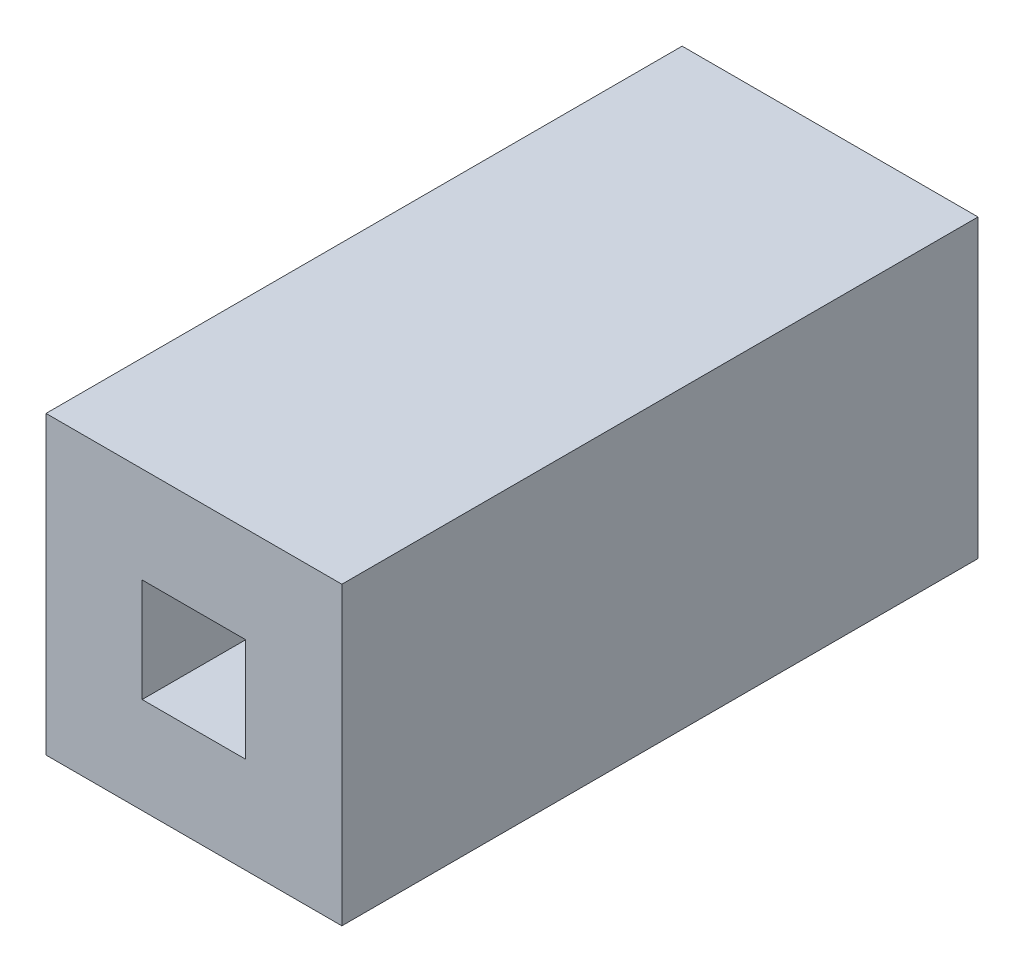
ISO-10303-21;
HEADER;
FILE_DESCRIPTION(('STEP AP214'),'2;1');
FILE_NAME('part.step','',(''),(''),'','','');
FILE_SCHEMA(('AUTOMOTIVE_DESIGN { 1 0 10303 214 1 1 1 1 }'));
ENDSEC;
DATA;
#1=APPLICATION_CONTEXT('core data for automotive mechanical design processes');
#2=APPLICATION_PROTOCOL_DEFINITION('international standard','automotive_design',2000,#1);
#3=PRODUCT_CONTEXT('',#1,'mechanical');
#4=PRODUCT('Part','Part','',(#3));
#5=PRODUCT_RELATED_PRODUCT_CATEGORY('part','',(#4));
#6=PRODUCT_DEFINITION_FORMATION('','',#4);
#7=PRODUCT_DEFINITION_CONTEXT('part definition',#1,'design');
#8=PRODUCT_DEFINITION('design','',#6,#7);
#9=PRODUCT_DEFINITION_SHAPE('','',#8);
#10=(LENGTH_UNIT() NAMED_UNIT(*) SI_UNIT(.MILLI.,.METRE.));
#11=(NAMED_UNIT(*) PLANE_ANGLE_UNIT() SI_UNIT($,.RADIAN.));
#12=(NAMED_UNIT(*) SI_UNIT($,.STERADIAN.) SOLID_ANGLE_UNIT());
#13=UNCERTAINTY_MEASURE_WITH_UNIT(LENGTH_MEASURE(1.E-05),#10,'distance_accuracy_value','');
#14=(GEOMETRIC_REPRESENTATION_CONTEXT(3) GLOBAL_UNCERTAINTY_ASSIGNED_CONTEXT((#13)) GLOBAL_UNIT_ASSIGNED_CONTEXT((#10,
#11,#12)) REPRESENTATION_CONTEXT('',''));
#15=CARTESIAN_POINT('',(0.,0.,0.));
#16=DIRECTION('',(0.,0.,1.));
#17=DIRECTION('',(1.,0.,0.));
#18=AXIS2_PLACEMENT_3D('',#15,#16,#17);
#19=CARTESIAN_POINT('',(0.35,0.35,0.));
#20=DIRECTION('',(1.,0.,0.));
#21=DIRECTION('',(0.,0.,-1.));
#22=AXIS2_PLACEMENT_3D('',#19,#20,#21);
#23=PLANE('',#22);
#24=DIRECTION('',(0.,0.,1.));
#25=VECTOR('',#24,1.);
#26=CARTESIAN_POINT('',(0.35,0.35,0.));
#27=LINE('',#26,#25);
#28=CARTESIAN_POINT('',(0.35,0.35,4.3));
#29=VERTEX_POINT('',#28);
#30=CARTESIAN_POINT('',(0.35,0.35,0.));
#31=VERTEX_POINT('',#30);
#32=EDGE_CURVE('E92',#29,#31,#27,.F.);
#33=ORIENTED_EDGE('',*,*,#32,.T.);
#34=DIRECTION('',(0.,1.,0.));
#35=VECTOR('',#34,1.);
#36=CARTESIAN_POINT('',(0.35,0.35,0.));
#37=LINE('',#36,#35);
#38=CARTESIAN_POINT('',(0.35,-0.35,0.));
#39=VERTEX_POINT('',#38);
#40=EDGE_CURVE('E20',#39,#31,#37,.T.);
#41=ORIENTED_EDGE('',*,*,#40,.F.);
#42=DIRECTION('',(0.,0.,-1.));
#43=VECTOR('',#42,1.);
#44=CARTESIAN_POINT('',(0.35,-0.35,0.));
#45=LINE('',#44,#43);
#46=CARTESIAN_POINT('',(0.35,-0.35,4.3));
#47=VERTEX_POINT('',#46);
#48=EDGE_CURVE('E110',#39,#47,#45,.F.);
#49=ORIENTED_EDGE('',*,*,#48,.T.);
#50=DIRECTION('',(0.,1.,0.));
#51=VECTOR('',#50,1.);
#52=CARTESIAN_POINT('',(0.35,0.35,4.3));
#53=LINE('',#52,#51);
#54=EDGE_CURVE('E79',#29,#47,#53,.F.);
#55=ORIENTED_EDGE('',*,*,#54,.F.);
#56=EDGE_LOOP('',(#33,#41,#49,#55));
#57=FACE_BOUND('',#56,.T.);
#58=ADVANCED_FACE('F17',(#57),#23,.F.);
#59=CARTESIAN_POINT('',(-0.35,0.35,0.));
#60=DIRECTION('',(0.,1.,0.));
#61=DIRECTION('',(0.,0.,1.));
#62=AXIS2_PLACEMENT_3D('',#59,#60,#61);
#63=PLANE('',#62);
#64=DIRECTION('',(0.,0.,1.));
#65=VECTOR('',#64,1.);
#66=CARTESIAN_POINT('',(-0.35,0.35,0.));
#67=LINE('',#66,#65);
#68=CARTESIAN_POINT('',(-0.35,0.35,4.3));
#69=VERTEX_POINT('',#68);
#70=CARTESIAN_POINT('',(-0.35,0.35,0.));
#71=VERTEX_POINT('',#70);
#72=EDGE_CURVE('E97',#69,#71,#67,.F.);
#73=ORIENTED_EDGE('',*,*,#72,.T.);
#74=DIRECTION('',(1.,0.,0.));
#75=VECTOR('',#74,1.);
#76=CARTESIAN_POINT('',(-0.35,0.35,0.));
#77=LINE('',#76,#75);
#78=EDGE_CURVE('E87',#31,#71,#77,.F.);
#79=ORIENTED_EDGE('',*,*,#78,.F.);
#80=ORIENTED_EDGE('',*,*,#32,.F.);
#81=DIRECTION('',(1.,0.,0.));
#82=VECTOR('',#81,1.);
#83=CARTESIAN_POINT('',(-0.35,0.35,4.3));
#84=LINE('',#83,#82);
#85=EDGE_CURVE('E99',#69,#29,#84,.T.);
#86=ORIENTED_EDGE('',*,*,#85,.F.);
#87=EDGE_LOOP('',(#73,#79,#80,#86));
#88=FACE_BOUND('',#87,.T.);
#89=ADVANCED_FACE('F95',(#88),#63,.F.);
#90=CARTESIAN_POINT('',(0.35,-0.35,0.));
#91=DIRECTION('',(0.,-1.,0.));
#92=DIRECTION('',(0.,0.,-1.));
#93=AXIS2_PLACEMENT_3D('',#90,#91,#92);
#94=PLANE('',#93);
#95=ORIENTED_EDGE('',*,*,#48,.F.);
#96=DIRECTION('',(1.,0.,0.));
#97=VECTOR('',#96,1.);
#98=CARTESIAN_POINT('',(0.35,-0.35,0.));
#99=LINE('',#98,#97);
#100=CARTESIAN_POINT('',(-0.35,-0.35,0.));
#101=VERTEX_POINT('',#100);
#102=EDGE_CURVE('E89',#101,#39,#99,.T.);
#103=ORIENTED_EDGE('',*,*,#102,.F.);
#104=DIRECTION('',(0.,0.,1.));
#105=VECTOR('',#104,1.);
#106=CARTESIAN_POINT('',(-0.35,-0.35,0.));
#107=LINE('',#106,#105);
#108=CARTESIAN_POINT('',(-0.35,-0.35,4.3));
#109=VERTEX_POINT('',#108);
#110=EDGE_CURVE('E115',#101,#109,#107,.T.);
#111=ORIENTED_EDGE('',*,*,#110,.T.);
#112=DIRECTION('',(1.,0.,0.));
#113=VECTOR('',#112,1.);
#114=CARTESIAN_POINT('',(0.,-0.35,4.3));
#115=LINE('',#114,#113);
#116=EDGE_CURVE('E109',#47,#109,#115,.F.);
#117=ORIENTED_EDGE('',*,*,#116,.F.);
#118=EDGE_LOOP('',(#95,#103,#111,#117));
#119=FACE_BOUND('',#118,.T.);
#120=ADVANCED_FACE('F113',(#119),#94,.F.);
#121=CARTESIAN_POINT('',(-0.35,-0.35,0.));
#122=DIRECTION('',(-1.,0.,0.));
#123=DIRECTION('',(0.,0.,1.));
#124=AXIS2_PLACEMENT_3D('',#121,#122,#123);
#125=PLANE('',#124);
#126=ORIENTED_EDGE('',*,*,#110,.F.);
#127=DIRECTION('',(0.,1.,0.));
#128=VECTOR('',#127,1.);
#129=CARTESIAN_POINT('',(-0.35,0.,0.));
#130=LINE('',#129,#128);
#131=EDGE_CURVE('E159',#101,#71,#130,.T.);
#132=ORIENTED_EDGE('',*,*,#131,.T.);
#133=ORIENTED_EDGE('',*,*,#72,.F.);
#134=DIRECTION('',(0.,1.,0.));
#135=VECTOR('',#134,1.);
#136=CARTESIAN_POINT('',(-0.35,0.,4.3));
#137=LINE('',#136,#135);
#138=EDGE_CURVE('E118',#109,#69,#137,.T.);
#139=ORIENTED_EDGE('',*,*,#138,.F.);
#140=EDGE_LOOP('',(#126,#132,#133,#139));
#141=FACE_BOUND('',#140,.T.);
#142=ADVANCED_FACE('F163',(#141),#125,.F.);
#143=CARTESIAN_POINT('',(-1.,-1.,0.));
#144=DIRECTION('',(-1.,0.,0.));
#145=DIRECTION('',(0.,0.,1.));
#146=AXIS2_PLACEMENT_3D('',#143,#144,#145);
#147=PLANE('',#146);
#148=DIRECTION('',(0.,1.,0.));
#149=VECTOR('',#148,1.);
#150=CARTESIAN_POINT('',(-1.,0.,0.));
#151=LINE('',#150,#149);
#152=CARTESIAN_POINT('',(-1.,1.,0.));
#153=VERTEX_POINT('',#152);
#154=CARTESIAN_POINT('',(-1.,-1.,0.));
#155=VERTEX_POINT('',#154);
#156=EDGE_CURVE('E139',#153,#155,#151,.F.);
#157=ORIENTED_EDGE('',*,*,#156,.T.);
#158=DIRECTION('',(0.,0.,-1.));
#159=VECTOR('',#158,1.);
#160=CARTESIAN_POINT('',(-1.,-1.,0.));
#161=LINE('',#160,#159);
#162=CARTESIAN_POINT('',(-1.,-1.,4.3));
#163=VERTEX_POINT('',#162);
#164=EDGE_CURVE('E121',#163,#155,#161,.T.);
#165=ORIENTED_EDGE('',*,*,#164,.F.);
#166=DIRECTION('',(0.,1.,0.));
#167=VECTOR('',#166,1.);
#168=CARTESIAN_POINT('',(-1.,0.,4.3));
#169=LINE('',#168,#167);
#170=CARTESIAN_POINT('',(-1.,1.,4.3));
#171=VERTEX_POINT('',#170);
#172=EDGE_CURVE('E123',#171,#163,#169,.F.);
#173=ORIENTED_EDGE('',*,*,#172,.F.);
#174=DIRECTION('',(0.,0.,1.));
#175=VECTOR('',#174,1.);
#176=CARTESIAN_POINT('',(-1.,1.,0.));
#177=LINE('',#176,#175);
#178=EDGE_CURVE('E152',#153,#171,#177,.T.);
#179=ORIENTED_EDGE('',*,*,#178,.F.);
#180=EDGE_LOOP('',(#157,#165,#173,#179));
#181=FACE_BOUND('',#180,.T.);
#182=ADVANCED_FACE('F138',(#181),#147,.T.);
#183=CARTESIAN_POINT('',(0.,0.,4.3));
#184=DIRECTION('',(0.,0.,1.));
#185=DIRECTION('',(1.,0.,0.));
#186=AXIS2_PLACEMENT_3D('',#183,#184,#185);
#187=PLANE('',#186);
#188=ORIENTED_EDGE('',*,*,#54,.T.);
#189=ORIENTED_EDGE('',*,*,#116,.T.);
#190=ORIENTED_EDGE('',*,*,#138,.T.);
#191=ORIENTED_EDGE('',*,*,#85,.T.);
#192=EDGE_LOOP('',(#188,#189,#190,#191));
#193=FACE_BOUND('',#192,.T.);
#194=ORIENTED_EDGE('',*,*,#172,.T.);
#195=DIRECTION('',(1.,0.,0.));
#196=VECTOR('',#195,1.);
#197=CARTESIAN_POINT('',(1.,-1.,4.3));
#198=LINE('',#197,#196);
#199=CARTESIAN_POINT('',(1.,-1.,4.3));
#200=VERTEX_POINT('',#199);
#201=EDGE_CURVE('E117',#200,#163,#198,.F.);
#202=ORIENTED_EDGE('',*,*,#201,.F.);
#203=DIRECTION('',(0.,1.,0.));
#204=VECTOR('',#203,1.);
#205=CARTESIAN_POINT('',(1.,1.,4.3));
#206=LINE('',#205,#204);
#207=CARTESIAN_POINT('',(1.,1.,4.3));
#208=VERTEX_POINT('',#207);
#209=EDGE_CURVE('E149',#208,#200,#206,.F.);
#210=ORIENTED_EDGE('',*,*,#209,.F.);
#211=DIRECTION('',(1.,0.,0.));
#212=VECTOR('',#211,1.);
#213=CARTESIAN_POINT('',(-1.,1.,4.3));
#214=LINE('',#213,#212);
#215=EDGE_CURVE('E133',#171,#208,#214,.T.);
#216=ORIENTED_EDGE('',*,*,#215,.F.);
#217=EDGE_LOOP('',(#194,#202,#210,#216));
#218=FACE_BOUND('',#217,.T.);
#219=ADVANCED_FACE('F105',(#193,#218),#187,.T.);
#220=CARTESIAN_POINT('',(1.,-1.,0.));
#221=DIRECTION('',(0.,-1.,0.));
#222=DIRECTION('',(0.,0.,-1.));
#223=AXIS2_PLACEMENT_3D('',#220,#221,#222);
#224=PLANE('',#223);
#225=DIRECTION('',(1.,0.,0.));
#226=VECTOR('',#225,1.);
#227=CARTESIAN_POINT('',(0.,-1.,0.));
#228=LINE('',#227,#226);
#229=CARTESIAN_POINT('',(1.,-1.,0.));
#230=VERTEX_POINT('',#229);
#231=EDGE_CURVE('E146',#155,#230,#228,.T.);
#232=ORIENTED_EDGE('',*,*,#231,.T.);
#233=DIRECTION('',(0.,0.,-1.));
#234=VECTOR('',#233,1.);
#235=CARTESIAN_POINT('',(1.,-1.,0.));
#236=LINE('',#235,#234);
#237=EDGE_CURVE('E144',#200,#230,#236,.T.);
#238=ORIENTED_EDGE('',*,*,#237,.F.);
#239=ORIENTED_EDGE('',*,*,#201,.T.);
#240=ORIENTED_EDGE('',*,*,#164,.T.);
#241=EDGE_LOOP('',(#232,#238,#239,#240));
#242=FACE_BOUND('',#241,.T.);
#243=ADVANCED_FACE('F142',(#242),#224,.T.);
#244=CARTESIAN_POINT('',(0.,0.,0.));
#245=DIRECTION('',(0.,0.,1.));
#246=DIRECTION('',(1.,0.,0.));
#247=AXIS2_PLACEMENT_3D('',#244,#245,#246);
#248=PLANE('',#247);
#249=ORIENTED_EDGE('',*,*,#102,.T.);
#250=ORIENTED_EDGE('',*,*,#40,.T.);
#251=ORIENTED_EDGE('',*,*,#78,.T.);
#252=ORIENTED_EDGE('',*,*,#131,.F.);
#253=EDGE_LOOP('',(#249,#250,#251,#252));
#254=FACE_BOUND('',#253,.T.);
#255=DIRECTION('',(0.,1.,0.));
#256=VECTOR('',#255,1.);
#257=CARTESIAN_POINT('',(1.,1.,0.));
#258=LINE('',#257,#256);
#259=CARTESIAN_POINT('',(1.,1.,0.));
#260=VERTEX_POINT('',#259);
#261=EDGE_CURVE('E26',#230,#260,#258,.T.);
#262=ORIENTED_EDGE('',*,*,#261,.F.);
#263=ORIENTED_EDGE('',*,*,#231,.F.);
#264=ORIENTED_EDGE('',*,*,#156,.F.);
#265=DIRECTION('',(1.,0.,0.));
#266=VECTOR('',#265,1.);
#267=CARTESIAN_POINT('',(-1.,1.,0.));
#268=LINE('',#267,#266);
#269=EDGE_CURVE('E35',#260,#153,#268,.F.);
#270=ORIENTED_EDGE('',*,*,#269,.F.);
#271=EDGE_LOOP('',(#262,#263,#264,#270));
#272=FACE_BOUND('',#271,.T.);
#273=ADVANCED_FACE('F84',(#254,#272),#248,.F.);
#274=CARTESIAN_POINT('',(-1.,1.,0.));
#275=DIRECTION('',(0.,1.,0.));
#276=DIRECTION('',(0.,0.,1.));
#277=AXIS2_PLACEMENT_3D('',#274,#275,#276);
#278=PLANE('',#277);
#279=ORIENTED_EDGE('',*,*,#269,.T.);
#280=ORIENTED_EDGE('',*,*,#178,.T.);
#281=ORIENTED_EDGE('',*,*,#215,.T.);
#282=DIRECTION('',(0.,0.,-1.));
#283=VECTOR('',#282,1.);
#284=CARTESIAN_POINT('',(1.,1.,0.));
#285=LINE('',#284,#283);
#286=EDGE_CURVE('E11',#260,#208,#285,.F.);
#287=ORIENTED_EDGE('',*,*,#286,.F.);
#288=EDGE_LOOP('',(#279,#280,#281,#287));
#289=FACE_BOUND('',#288,.T.);
#290=ADVANCED_FACE('F174',(#289),#278,.T.);
#291=CARTESIAN_POINT('',(1.,1.,0.));
#292=DIRECTION('',(1.,0.,0.));
#293=DIRECTION('',(0.,0.,-1.));
#294=AXIS2_PLACEMENT_3D('',#291,#292,#293);
#295=PLANE('',#294);
#296=ORIENTED_EDGE('',*,*,#261,.T.);
#297=ORIENTED_EDGE('',*,*,#286,.T.);
#298=ORIENTED_EDGE('',*,*,#209,.T.);
#299=ORIENTED_EDGE('',*,*,#237,.T.);
#300=EDGE_LOOP('',(#296,#297,#298,#299));
#301=FACE_BOUND('',#300,.T.);
#302=ADVANCED_FACE('F151',(#301),#295,.T.);
#303=CLOSED_SHELL('',(#58,#89,#120,#142,#182,#219,#243,#273,#290,#302));
#304=MANIFOLD_SOLID_BREP('B1',#303);
#305=ADVANCED_BREP_SHAPE_REPRESENTATION('',(#18,#304),#14);
#306=SHAPE_DEFINITION_REPRESENTATION(#9,#305);
ENDSEC;
END-ISO-10303-21;
